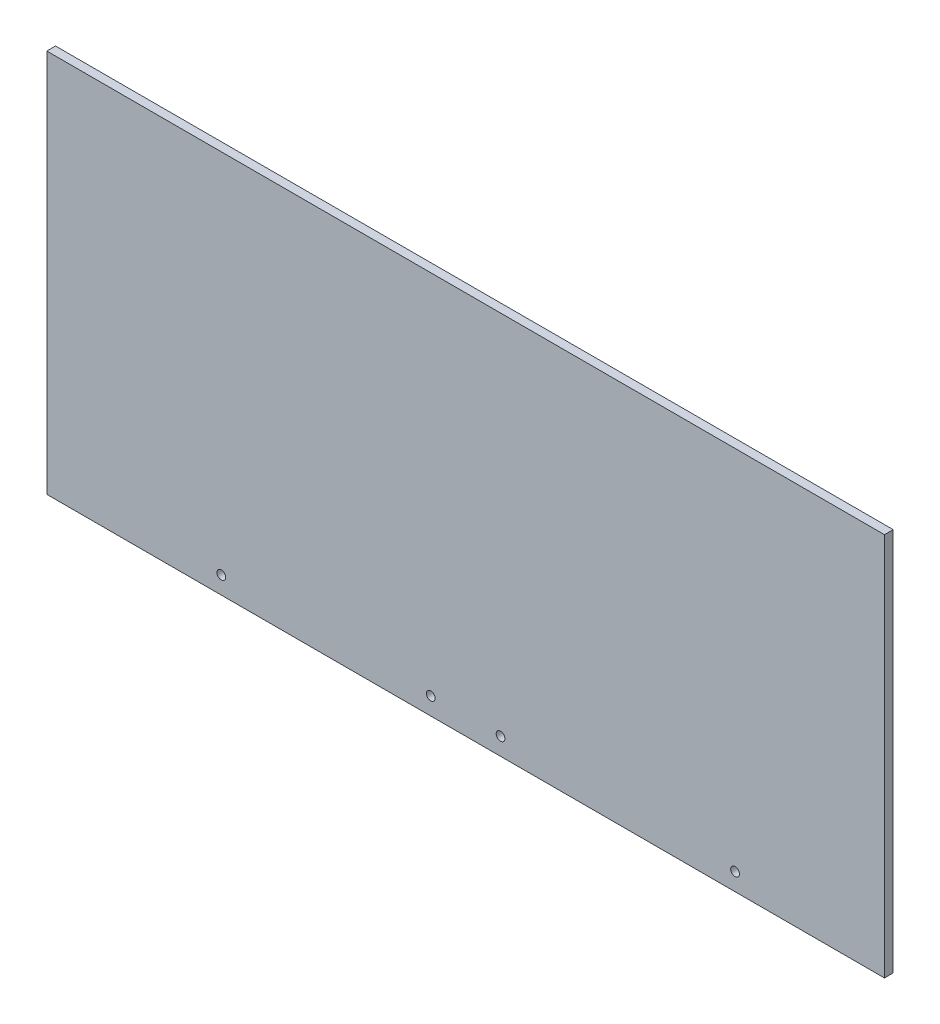
ISO-10303-21;
HEADER;
FILE_DESCRIPTION(('STEP AP214'),'2;1');
FILE_NAME('part.step','',(''),(''),'','','');
FILE_SCHEMA(('AUTOMOTIVE_DESIGN { 1 0 10303 214 1 1 1 1 }'));
ENDSEC;
DATA;
#1=APPLICATION_CONTEXT('core data for automotive mechanical design processes');
#2=APPLICATION_PROTOCOL_DEFINITION('international standard','automotive_design',2000,#1);
#3=PRODUCT_CONTEXT('',#1,'mechanical');
#4=PRODUCT('Part','Part','',(#3));
#5=PRODUCT_RELATED_PRODUCT_CATEGORY('part','',(#4));
#6=PRODUCT_DEFINITION_FORMATION('','',#4);
#7=PRODUCT_DEFINITION_CONTEXT('part definition',#1,'design');
#8=PRODUCT_DEFINITION('design','',#6,#7);
#9=PRODUCT_DEFINITION_SHAPE('','',#8);
#10=(LENGTH_UNIT() NAMED_UNIT(*) SI_UNIT(.MILLI.,.METRE.));
#11=(NAMED_UNIT(*) PLANE_ANGLE_UNIT() SI_UNIT($,.RADIAN.));
#12=(NAMED_UNIT(*) SI_UNIT($,.STERADIAN.) SOLID_ANGLE_UNIT());
#13=UNCERTAINTY_MEASURE_WITH_UNIT(LENGTH_MEASURE(1.E-05),#10,'distance_accuracy_value','');
#14=(GEOMETRIC_REPRESENTATION_CONTEXT(3) GLOBAL_UNCERTAINTY_ASSIGNED_CONTEXT((#13)) GLOBAL_UNIT_ASSIGNED_CONTEXT((#10,
#11,#12)) REPRESENTATION_CONTEXT('',''));
#15=CARTESIAN_POINT('',(0.,0.,0.));
#16=DIRECTION('',(0.,0.,1.));
#17=DIRECTION('',(1.,0.,0.));
#18=AXIS2_PLACEMENT_3D('',#15,#16,#17);
#19=CARTESIAN_POINT('',(0.,77.8676767676767,6.35));
#20=DIRECTION('',(0.,-1.,0.));
#21=DIRECTION('',(0.,0.,-1.));
#22=AXIS2_PLACEMENT_3D('',#19,#20,#21);
#23=PLANE('',#22);
#24=DIRECTION('',(-1.,0.,0.));
#25=VECTOR('',#24,1.);
#26=CARTESIAN_POINT('',(0.,77.8676767676767,0.));
#27=LINE('',#26,#25);
#28=CARTESIAN_POINT('',(284.787878787879,77.8676767676767,0.));
#29=VERTEX_POINT('',#28);
#30=CARTESIAN_POINT('',(-324.812121212121,77.8676767676767,0.));
#31=VERTEX_POINT('',#30);
#32=EDGE_CURVE('E116',#29,#31,#27,.T.);
#33=ORIENTED_EDGE('',*,*,#32,.T.);
#34=DIRECTION('',(0.,0.,-1.));
#35=VECTOR('',#34,1.);
#36=CARTESIAN_POINT('',(-324.812121212121,77.8676767676767,6.35));
#37=LINE('',#36,#35);
#38=CARTESIAN_POINT('',(-324.812121212121,77.8676767676767,6.35));
#39=VERTEX_POINT('',#38);
#40=EDGE_CURVE('E11',#39,#31,#37,.T.);
#41=ORIENTED_EDGE('',*,*,#40,.F.);
#42=DIRECTION('',(-1.,0.,0.));
#43=VECTOR('',#42,1.);
#44=CARTESIAN_POINT('',(0.,77.8676767676767,6.35));
#45=LINE('',#44,#43);
#46=CARTESIAN_POINT('',(284.787878787879,77.8676767676767,6.35));
#47=VERTEX_POINT('',#46);
#48=EDGE_CURVE('E90',#47,#39,#45,.T.);
#49=ORIENTED_EDGE('',*,*,#48,.F.);
#50=DIRECTION('',(0.,0.,-1.));
#51=VECTOR('',#50,1.);
#52=CARTESIAN_POINT('',(284.787878787879,77.8676767676767,6.35));
#53=LINE('',#52,#51);
#54=EDGE_CURVE('E56',#47,#29,#53,.T.);
#55=ORIENTED_EDGE('',*,*,#54,.T.);
#56=EDGE_LOOP('',(#33,#41,#49,#55));
#57=FACE_BOUND('',#56,.T.);
#58=ADVANCED_FACE('F39',(#57),#23,.F.);
#59=CARTESIAN_POINT('',(-324.812121212121,0.,6.35));
#60=DIRECTION('',(1.,0.,0.));
#61=DIRECTION('',(0.,1.,0.));
#62=AXIS2_PLACEMENT_3D('',#59,#60,#61);
#63=PLANE('',#62);
#64=DIRECTION('',(0.,-1.,0.));
#65=VECTOR('',#64,1.);
#66=CARTESIAN_POINT('',(-324.812121212121,0.,0.));
#67=LINE('',#66,#65);
#68=CARTESIAN_POINT('',(-324.812121212121,-201.532323232323,0.));
#69=VERTEX_POINT('',#68);
#70=EDGE_CURVE('E95',#31,#69,#67,.T.);
#71=ORIENTED_EDGE('',*,*,#70,.T.);
#72=DIRECTION('',(0.,0.,-1.));
#73=VECTOR('',#72,1.);
#74=CARTESIAN_POINT('',(-324.812121212121,-201.532323232323,6.35));
#75=LINE('',#74,#73);
#76=CARTESIAN_POINT('',(-324.812121212121,-201.532323232323,6.35));
#77=VERTEX_POINT('',#76);
#78=EDGE_CURVE('E48',#77,#69,#75,.T.);
#79=ORIENTED_EDGE('',*,*,#78,.F.);
#80=DIRECTION('',(0.,-1.,0.));
#81=VECTOR('',#80,1.);
#82=CARTESIAN_POINT('',(-324.812121212121,0.,6.35));
#83=LINE('',#82,#81);
#84=EDGE_CURVE('E81',#39,#77,#83,.T.);
#85=ORIENTED_EDGE('',*,*,#84,.F.);
#86=ORIENTED_EDGE('',*,*,#40,.T.);
#87=EDGE_LOOP('',(#71,#79,#85,#86));
#88=FACE_BOUND('',#87,.T.);
#89=ADVANCED_FACE('F94',(#88),#63,.F.);
#90=CARTESIAN_POINT('',(0.,-201.532323232323,6.35));
#91=DIRECTION('',(0.,-1.,0.));
#92=DIRECTION('',(1.,0.,0.));
#93=AXIS2_PLACEMENT_3D('',#90,#91,#92);
#94=PLANE('',#93);
#95=DIRECTION('',(-1.,0.,0.));
#96=VECTOR('',#95,1.);
#97=CARTESIAN_POINT('',(0.,-201.532323232323,0.));
#98=LINE('',#97,#96);
#99=CARTESIAN_POINT('',(284.787878787879,-201.532323232323,0.));
#100=VERTEX_POINT('',#99);
#101=EDGE_CURVE('E119',#100,#69,#98,.T.);
#102=ORIENTED_EDGE('',*,*,#101,.F.);
#103=DIRECTION('',(0.,0.,-1.));
#104=VECTOR('',#103,1.);
#105=CARTESIAN_POINT('',(284.787878787879,-201.532323232323,6.35));
#106=LINE('',#105,#104);
#107=CARTESIAN_POINT('',(284.787878787879,-201.532323232323,6.35));
#108=VERTEX_POINT('',#107);
#109=EDGE_CURVE('E70',#108,#100,#106,.T.);
#110=ORIENTED_EDGE('',*,*,#109,.F.);
#111=DIRECTION('',(-1.,0.,0.));
#112=VECTOR('',#111,1.);
#113=CARTESIAN_POINT('',(0.,-201.532323232323,6.35));
#114=LINE('',#113,#112);
#115=EDGE_CURVE('E89',#108,#77,#114,.T.);
#116=ORIENTED_EDGE('',*,*,#115,.T.);
#117=ORIENTED_EDGE('',*,*,#78,.T.);
#118=EDGE_LOOP('',(#102,#110,#116,#117));
#119=FACE_BOUND('',#118,.T.);
#120=ADVANCED_FACE('F98',(#119),#94,.T.);
#121=CARTESIAN_POINT('',(5.38787878787879,-188.832323232323,6.35));
#122=DIRECTION('',(0.,0.,-1.));
#123=DIRECTION('',(-1.,0.,0.));
#124=AXIS2_PLACEMENT_3D('',#121,#122,#123);
#125=CYLINDRICAL_SURFACE('',#124,3.175);
#126=CARTESIAN_POINT('',(5.38787878787879,-188.832323232323,6.35));
#127=DIRECTION('',(0.,0.,1.));
#128=DIRECTION('',(1.,0.,0.));
#129=AXIS2_PLACEMENT_3D('',#126,#127,#128);
#130=CIRCLE('',#129,3.175);
#131=CARTESIAN_POINT('',(8.56287878787879,-188.832323232323,6.35));
#132=VERTEX_POINT('',#131);
#133=EDGE_CURVE('E107',#132,#132,#130,.T.);
#134=ORIENTED_EDGE('',*,*,#133,.T.);
#135=EDGE_LOOP('',(#134));
#136=FACE_BOUND('',#135,.T.);
#137=CARTESIAN_POINT('',(5.38787878787879,-188.832323232323,0.));
#138=DIRECTION('',(0.,0.,1.));
#139=DIRECTION('',(1.,0.,0.));
#140=AXIS2_PLACEMENT_3D('',#137,#138,#139);
#141=CIRCLE('',#140,3.175);
#142=CARTESIAN_POINT('',(8.56287878787879,-188.832323232323,0.));
#143=VERTEX_POINT('',#142);
#144=EDGE_CURVE('E127',#143,#143,#141,.T.);
#145=ORIENTED_EDGE('',*,*,#144,.F.);
#146=EDGE_LOOP('',(#145));
#147=FACE_BOUND('',#146,.T.);
#148=ADVANCED_FACE('F163',(#136,#147),#125,.F.);
#149=CARTESIAN_POINT('',(-45.4121212121212,-188.832323232323,6.35));
#150=DIRECTION('',(0.,0.,-1.));
#151=DIRECTION('',(-1.,0.,0.));
#152=AXIS2_PLACEMENT_3D('',#149,#150,#151);
#153=CYLINDRICAL_SURFACE('',#152,3.175);
#154=CARTESIAN_POINT('',(-45.4121212121212,-188.832323232323,6.35));
#155=DIRECTION('',(0.,0.,1.));
#156=DIRECTION('',(1.,0.,0.));
#157=AXIS2_PLACEMENT_3D('',#154,#155,#156);
#158=CIRCLE('',#157,3.175);
#159=CARTESIAN_POINT('',(-42.2371212121212,-188.832323232323,6.35));
#160=VERTEX_POINT('',#159);
#161=EDGE_CURVE('E101',#160,#160,#158,.T.);
#162=ORIENTED_EDGE('',*,*,#161,.T.);
#163=EDGE_LOOP('',(#162));
#164=FACE_BOUND('',#163,.T.);
#165=CARTESIAN_POINT('',(-45.4121212121212,-188.832323232323,0.));
#166=DIRECTION('',(0.,0.,1.));
#167=DIRECTION('',(1.,0.,0.));
#168=AXIS2_PLACEMENT_3D('',#165,#166,#167);
#169=CIRCLE('',#168,3.175);
#170=CARTESIAN_POINT('',(-42.2371212121212,-188.832323232323,0.));
#171=VERTEX_POINT('',#170);
#172=EDGE_CURVE('E124',#171,#171,#169,.T.);
#173=ORIENTED_EDGE('',*,*,#172,.F.);
#174=EDGE_LOOP('',(#173));
#175=FACE_BOUND('',#174,.T.);
#176=ADVANCED_FACE('F167',(#164,#175),#153,.F.);
#177=CARTESIAN_POINT('',(284.787878787879,0.,6.35));
#178=DIRECTION('',(1.,0.,0.));
#179=DIRECTION('',(0.,0.,-1.));
#180=AXIS2_PLACEMENT_3D('',#177,#178,#179);
#181=PLANE('',#180);
#182=DIRECTION('',(0.,-1.,0.));
#183=VECTOR('',#182,1.);
#184=CARTESIAN_POINT('',(284.787878787879,0.,0.));
#185=LINE('',#184,#183);
#186=EDGE_CURVE('E121',#29,#100,#185,.T.);
#187=ORIENTED_EDGE('',*,*,#186,.F.);
#188=ORIENTED_EDGE('',*,*,#54,.F.);
#189=DIRECTION('',(0.,-1.,0.));
#190=VECTOR('',#189,1.);
#191=CARTESIAN_POINT('',(284.787878787879,0.,6.35));
#192=LINE('',#191,#190);
#193=EDGE_CURVE('E99',#47,#108,#192,.T.);
#194=ORIENTED_EDGE('',*,*,#193,.T.);
#195=ORIENTED_EDGE('',*,*,#109,.T.);
#196=EDGE_LOOP('',(#187,#188,#194,#195));
#197=FACE_BOUND('',#196,.T.);
#198=ADVANCED_FACE('F164',(#197),#181,.T.);
#199=CARTESIAN_POINT('',(-197.812121212121,-188.832323232323,6.35));
#200=DIRECTION('',(0.,0.,-1.));
#201=DIRECTION('',(-1.,0.,0.));
#202=AXIS2_PLACEMENT_3D('',#199,#200,#201);
#203=CYLINDRICAL_SURFACE('',#202,3.175);
#204=CARTESIAN_POINT('',(-197.812121212121,-188.832323232323,6.35));
#205=DIRECTION('',(0.,0.,1.));
#206=DIRECTION('',(1.,0.,0.));
#207=AXIS2_PLACEMENT_3D('',#204,#205,#206);
#208=CIRCLE('',#207,3.175);
#209=CARTESIAN_POINT('',(-194.637121212121,-188.832323232323,6.35));
#210=VERTEX_POINT('',#209);
#211=EDGE_CURVE('E133',#210,#210,#208,.T.);
#212=ORIENTED_EDGE('',*,*,#211,.T.);
#213=EDGE_LOOP('',(#212));
#214=FACE_BOUND('',#213,.T.);
#215=CARTESIAN_POINT('',(-197.812121212121,-188.832323232323,0.));
#216=DIRECTION('',(0.,0.,1.));
#217=DIRECTION('',(1.,0.,0.));
#218=AXIS2_PLACEMENT_3D('',#215,#216,#217);
#219=CIRCLE('',#218,3.175);
#220=CARTESIAN_POINT('',(-194.637121212121,-188.832323232323,0.));
#221=VERTEX_POINT('',#220);
#222=EDGE_CURVE('E113',#221,#221,#219,.T.);
#223=ORIENTED_EDGE('',*,*,#222,.F.);
#224=EDGE_LOOP('',(#223));
#225=FACE_BOUND('',#224,.T.);
#226=ADVANCED_FACE('F41',(#214,#225),#203,.F.);
#227=CARTESIAN_POINT('',(176.050478787879,-188.832323232323,6.35));
#228=DIRECTION('',(0.,0.,-1.));
#229=DIRECTION('',(-1.,0.,0.));
#230=AXIS2_PLACEMENT_3D('',#227,#228,#229);
#231=CYLINDRICAL_SURFACE('',#230,3.175);
#232=CARTESIAN_POINT('',(176.050478787879,-188.832323232323,6.35));
#233=DIRECTION('',(0.,0.,1.));
#234=DIRECTION('',(1.,0.,0.));
#235=AXIS2_PLACEMENT_3D('',#232,#233,#234);
#236=CIRCLE('',#235,3.175);
#237=CARTESIAN_POINT('',(179.225478787879,-188.832323232323,6.35));
#238=VERTEX_POINT('',#237);
#239=EDGE_CURVE('E110',#238,#238,#236,.T.);
#240=ORIENTED_EDGE('',*,*,#239,.T.);
#241=EDGE_LOOP('',(#240));
#242=FACE_BOUND('',#241,.T.);
#243=CARTESIAN_POINT('',(176.050478787879,-188.832323232323,0.));
#244=DIRECTION('',(0.,0.,1.));
#245=DIRECTION('',(1.,0.,0.));
#246=AXIS2_PLACEMENT_3D('',#243,#244,#245);
#247=CIRCLE('',#246,3.175);
#248=CARTESIAN_POINT('',(179.225478787879,-188.832323232323,0.));
#249=VERTEX_POINT('',#248);
#250=EDGE_CURVE('E130',#249,#249,#247,.T.);
#251=ORIENTED_EDGE('',*,*,#250,.F.);
#252=EDGE_LOOP('',(#251));
#253=FACE_BOUND('',#252,.T.);
#254=ADVANCED_FACE('F145',(#242,#253),#231,.F.);
#255=CARTESIAN_POINT('',(0.,0.,6.35));
#256=DIRECTION('',(0.,0.,1.));
#257=DIRECTION('',(1.,0.,0.));
#258=AXIS2_PLACEMENT_3D('',#255,#256,#257);
#259=PLANE('',#258);
#260=ORIENTED_EDGE('',*,*,#211,.F.);
#261=EDGE_LOOP('',(#260));
#262=FACE_BOUND('',#261,.T.);
#263=ORIENTED_EDGE('',*,*,#48,.T.);
#264=ORIENTED_EDGE('',*,*,#84,.T.);
#265=ORIENTED_EDGE('',*,*,#115,.F.);
#266=ORIENTED_EDGE('',*,*,#193,.F.);
#267=EDGE_LOOP('',(#263,#264,#265,#266));
#268=FACE_BOUND('',#267,.T.);
#269=ORIENTED_EDGE('',*,*,#161,.F.);
#270=EDGE_LOOP('',(#269));
#271=FACE_BOUND('',#270,.T.);
#272=ORIENTED_EDGE('',*,*,#133,.F.);
#273=EDGE_LOOP('',(#272));
#274=FACE_BOUND('',#273,.T.);
#275=ORIENTED_EDGE('',*,*,#239,.F.);
#276=EDGE_LOOP('',(#275));
#277=FACE_BOUND('',#276,.T.);
#278=ADVANCED_FACE('F85',(#262,#268,#271,#274,#277),#259,.T.);
#279=CARTESIAN_POINT('',(0.,0.,0.));
#280=DIRECTION('',(0.,0.,1.));
#281=DIRECTION('',(1.,0.,0.));
#282=AXIS2_PLACEMENT_3D('',#279,#280,#281);
#283=PLANE('',#282);
#284=ORIENTED_EDGE('',*,*,#222,.T.);
#285=EDGE_LOOP('',(#284));
#286=FACE_BOUND('',#285,.T.);
#287=ORIENTED_EDGE('',*,*,#32,.F.);
#288=ORIENTED_EDGE('',*,*,#186,.T.);
#289=ORIENTED_EDGE('',*,*,#101,.T.);
#290=ORIENTED_EDGE('',*,*,#70,.F.);
#291=EDGE_LOOP('',(#287,#288,#289,#290));
#292=FACE_BOUND('',#291,.T.);
#293=ORIENTED_EDGE('',*,*,#172,.T.);
#294=EDGE_LOOP('',(#293));
#295=FACE_BOUND('',#294,.T.);
#296=ORIENTED_EDGE('',*,*,#144,.T.);
#297=EDGE_LOOP('',(#296));
#298=FACE_BOUND('',#297,.T.);
#299=ORIENTED_EDGE('',*,*,#250,.T.);
#300=EDGE_LOOP('',(#299));
#301=FACE_BOUND('',#300,.T.);
#302=ADVANCED_FACE('F144',(#286,#292,#295,#298,#301),#283,.F.);
#303=CLOSED_SHELL('',(#58,#89,#120,#148,#176,#198,#226,#254,#278,#302));
#304=MANIFOLD_SOLID_BREP('B2',#303);
#305=ADVANCED_BREP_SHAPE_REPRESENTATION('',(#18,#304),#14);
#306=SHAPE_DEFINITION_REPRESENTATION(#9,#305);
ENDSEC;
END-ISO-10303-21;
